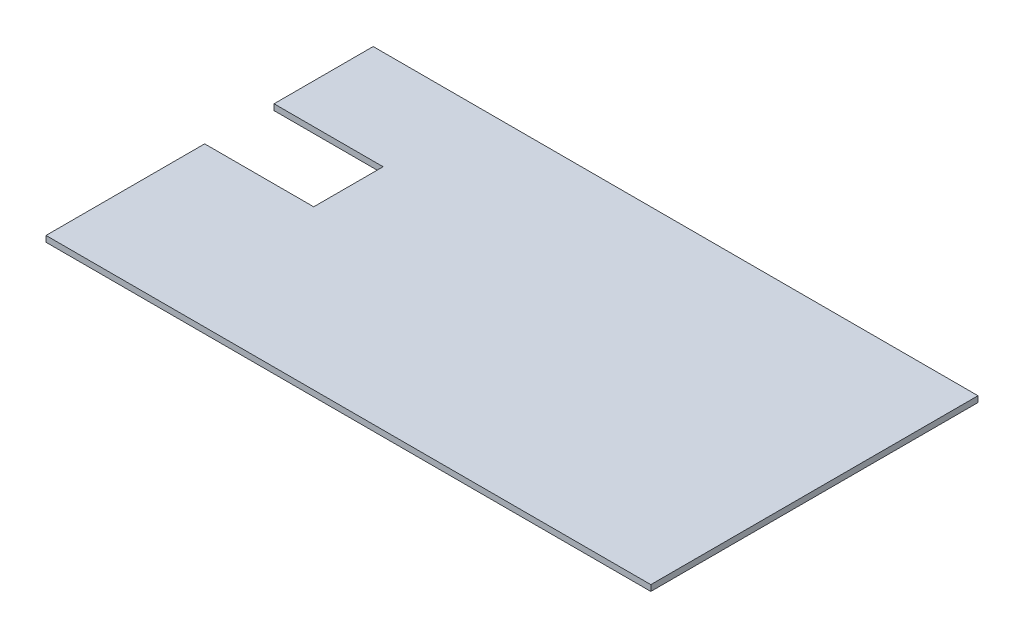
ISO-10303-21;
HEADER;
FILE_DESCRIPTION(('STEP AP214'),'2;1');
FILE_NAME('part.step','',(''),(''),'','','');
FILE_SCHEMA(('AUTOMOTIVE_DESIGN { 1 0 10303 214 1 1 1 1 }'));
ENDSEC;
DATA;
#1=APPLICATION_CONTEXT('core data for automotive mechanical design processes');
#2=APPLICATION_PROTOCOL_DEFINITION('international standard','automotive_design',2000,#1);
#3=PRODUCT_CONTEXT('',#1,'mechanical');
#4=PRODUCT('Part','Part','',(#3));
#5=PRODUCT_RELATED_PRODUCT_CATEGORY('part','',(#4));
#6=PRODUCT_DEFINITION_FORMATION('','',#4);
#7=PRODUCT_DEFINITION_CONTEXT('part definition',#1,'design');
#8=PRODUCT_DEFINITION('design','',#6,#7);
#9=PRODUCT_DEFINITION_SHAPE('','',#8);
#10=(LENGTH_UNIT() NAMED_UNIT(*) SI_UNIT(.MILLI.,.METRE.));
#11=(NAMED_UNIT(*) PLANE_ANGLE_UNIT() SI_UNIT($,.RADIAN.));
#12=(NAMED_UNIT(*) SI_UNIT($,.STERADIAN.) SOLID_ANGLE_UNIT());
#13=UNCERTAINTY_MEASURE_WITH_UNIT(LENGTH_MEASURE(1.E-05),#10,'distance_accuracy_value','');
#14=(GEOMETRIC_REPRESENTATION_CONTEXT(3) GLOBAL_UNCERTAINTY_ASSIGNED_CONTEXT((#13)) GLOBAL_UNIT_ASSIGNED_CONTEXT((#10,
#11,#12)) REPRESENTATION_CONTEXT('',''));
#15=CARTESIAN_POINT('',(0.,0.,0.));
#16=DIRECTION('',(0.,0.,1.));
#17=DIRECTION('',(1.,0.,0.));
#18=AXIS2_PLACEMENT_3D('',#15,#16,#17);
#19=CARTESIAN_POINT('',(-31.,0.,-6.5));
#20=DIRECTION('',(0.,1.,0.));
#21=DIRECTION('',(0.,0.,1.));
#22=AXIS2_PLACEMENT_3D('',#19,#20,#21);
#23=PLANE('',#22);
#24=DIRECTION('',(1.,0.,0.));
#25=VECTOR('',#24,1.);
#26=CARTESIAN_POINT('',(30.,0.,-16.5));
#27=LINE('',#26,#25);
#28=CARTESIAN_POINT('',(-31.,0.,-16.5));
#29=VERTEX_POINT('',#28);
#30=CARTESIAN_POINT('',(30.,0.,-16.5));
#31=VERTEX_POINT('',#30);
#32=EDGE_CURVE('E124',#29,#31,#27,.T.);
#33=ORIENTED_EDGE('',*,*,#32,.T.);
#34=DIRECTION('',(0.,0.,1.));
#35=VECTOR('',#34,1.);
#36=CARTESIAN_POINT('',(30.,0.,16.5));
#37=LINE('',#36,#35);
#38=CARTESIAN_POINT('',(30.,0.,16.5));
#39=VERTEX_POINT('',#38);
#40=EDGE_CURVE('E119',#31,#39,#37,.T.);
#41=ORIENTED_EDGE('',*,*,#40,.T.);
#42=DIRECTION('',(-1.,0.,0.));
#43=VECTOR('',#42,1.);
#44=CARTESIAN_POINT('',(30.,0.,16.5));
#45=LINE('',#44,#43);
#46=CARTESIAN_POINT('',(-31.,0.,16.5));
#47=VERTEX_POINT('',#46);
#48=EDGE_CURVE('E114',#39,#47,#45,.T.);
#49=ORIENTED_EDGE('',*,*,#48,.T.);
#50=DIRECTION('',(0.,0.,-1.));
#51=VECTOR('',#50,1.);
#52=CARTESIAN_POINT('',(-31.,0.,0.5));
#53=LINE('',#52,#51);
#54=CARTESIAN_POINT('',(-31.,0.,0.5));
#55=VERTEX_POINT('',#54);
#56=EDGE_CURVE('E109',#47,#55,#53,.T.);
#57=ORIENTED_EDGE('',*,*,#56,.T.);
#58=DIRECTION('',(1.,0.,0.));
#59=VECTOR('',#58,1.);
#60=CARTESIAN_POINT('',(-20.,0.,0.5));
#61=LINE('',#60,#59);
#62=CARTESIAN_POINT('',(-20.,0.,0.5));
#63=VERTEX_POINT('',#62);
#64=EDGE_CURVE('E105',#55,#63,#61,.T.);
#65=ORIENTED_EDGE('',*,*,#64,.T.);
#66=DIRECTION('',(0.,0.,-1.));
#67=VECTOR('',#66,1.);
#68=CARTESIAN_POINT('',(-20.,0.,-6.5));
#69=LINE('',#68,#67);
#70=CARTESIAN_POINT('',(-20.,0.,-6.5));
#71=VERTEX_POINT('',#70);
#72=EDGE_CURVE('E92',#63,#71,#69,.T.);
#73=ORIENTED_EDGE('',*,*,#72,.T.);
#74=DIRECTION('',(-1.,0.,0.));
#75=VECTOR('',#74,1.);
#76=CARTESIAN_POINT('',(-31.,0.,-6.5));
#77=LINE('',#76,#75);
#78=CARTESIAN_POINT('',(-31.,0.,-6.5));
#79=VERTEX_POINT('',#78);
#80=EDGE_CURVE('E78',#71,#79,#77,.T.);
#81=ORIENTED_EDGE('',*,*,#80,.T.);
#82=DIRECTION('',(0.,0.,-1.));
#83=VECTOR('',#82,1.);
#84=CARTESIAN_POINT('',(-31.,0.,-16.5));
#85=LINE('',#84,#83);
#86=EDGE_CURVE('E19',#79,#29,#85,.T.);
#87=ORIENTED_EDGE('',*,*,#86,.T.);
#88=EDGE_LOOP('',(#33,#41,#49,#57,#65,#73,#81,#87));
#89=FACE_BOUND('',#88,.T.);
#90=ADVANCED_FACE('F16',(#89),#23,.F.);
#91=CARTESIAN_POINT('',(-31.,0.6,-16.5));
#92=DIRECTION('',(1.,0.,0.));
#93=DIRECTION('',(0.,0.,-1.));
#94=AXIS2_PLACEMENT_3D('',#91,#92,#93);
#95=PLANE('',#94);
#96=DIRECTION('',(0.,1.,0.));
#97=VECTOR('',#96,1.);
#98=CARTESIAN_POINT('',(-31.,0.6,-6.5));
#99=LINE('',#98,#97);
#100=CARTESIAN_POINT('',(-31.,0.6,-6.5));
#101=VERTEX_POINT('',#100);
#102=EDGE_CURVE('E84',#79,#101,#99,.T.);
#103=ORIENTED_EDGE('',*,*,#102,.T.);
#104=DIRECTION('',(0.,0.,1.));
#105=VECTOR('',#104,1.);
#106=CARTESIAN_POINT('',(-31.,0.6,-6.5));
#107=LINE('',#106,#105);
#108=CARTESIAN_POINT('',(-31.,0.6,-16.5));
#109=VERTEX_POINT('',#108);
#110=EDGE_CURVE('E126',#109,#101,#107,.T.);
#111=ORIENTED_EDGE('',*,*,#110,.F.);
#112=DIRECTION('',(0.,1.,0.));
#113=VECTOR('',#112,1.);
#114=CARTESIAN_POINT('',(-31.,0.6,-16.5));
#115=LINE('',#114,#113);
#116=EDGE_CURVE('E87',#109,#29,#115,.F.);
#117=ORIENTED_EDGE('',*,*,#116,.T.);
#118=ORIENTED_EDGE('',*,*,#86,.F.);
#119=EDGE_LOOP('',(#103,#111,#117,#118));
#120=FACE_BOUND('',#119,.T.);
#121=ADVANCED_FACE('F83',(#120),#95,.F.);
#122=CARTESIAN_POINT('',(-31.,0.6,-6.5));
#123=DIRECTION('',(0.,0.,-1.));
#124=DIRECTION('',(-1.,0.,0.));
#125=AXIS2_PLACEMENT_3D('',#122,#123,#124);
#126=PLANE('',#125);
#127=DIRECTION('',(0.,1.,0.));
#128=VECTOR('',#127,1.);
#129=CARTESIAN_POINT('',(-20.,0.6,-6.5));
#130=LINE('',#129,#128);
#131=CARTESIAN_POINT('',(-20.,0.6,-6.5));
#132=VERTEX_POINT('',#131);
#133=EDGE_CURVE('E94',#71,#132,#130,.T.);
#134=ORIENTED_EDGE('',*,*,#133,.T.);
#135=DIRECTION('',(1.,0.,0.));
#136=VECTOR('',#135,1.);
#137=CARTESIAN_POINT('',(-31.,0.6,-6.5));
#138=LINE('',#137,#136);
#139=EDGE_CURVE('E98',#101,#132,#138,.T.);
#140=ORIENTED_EDGE('',*,*,#139,.F.);
#141=ORIENTED_EDGE('',*,*,#102,.F.);
#142=ORIENTED_EDGE('',*,*,#80,.F.);
#143=EDGE_LOOP('',(#134,#140,#141,#142));
#144=FACE_BOUND('',#143,.T.);
#145=ADVANCED_FACE('F96',(#144),#126,.F.);
#146=CARTESIAN_POINT('',(-20.,0.6,-6.5));
#147=DIRECTION('',(1.,0.,0.));
#148=DIRECTION('',(0.,0.,-1.));
#149=AXIS2_PLACEMENT_3D('',#146,#147,#148);
#150=PLANE('',#149);
#151=DIRECTION('',(0.,1.,0.));
#152=VECTOR('',#151,1.);
#153=CARTESIAN_POINT('',(-20.,0.6,0.5));
#154=LINE('',#153,#152);
#155=CARTESIAN_POINT('',(-20.,0.6,0.5));
#156=VERTEX_POINT('',#155);
#157=EDGE_CURVE('E103',#63,#156,#154,.T.);
#158=ORIENTED_EDGE('',*,*,#157,.T.);
#159=DIRECTION('',(0.,0.,1.));
#160=VECTOR('',#159,1.);
#161=CARTESIAN_POINT('',(-20.,0.6,-6.5));
#162=LINE('',#161,#160);
#163=EDGE_CURVE('E129',#132,#156,#162,.T.);
#164=ORIENTED_EDGE('',*,*,#163,.F.);
#165=ORIENTED_EDGE('',*,*,#133,.F.);
#166=ORIENTED_EDGE('',*,*,#72,.F.);
#167=EDGE_LOOP('',(#158,#164,#165,#166));
#168=FACE_BOUND('',#167,.T.);
#169=ADVANCED_FACE('F172',(#168),#150,.F.);
#170=CARTESIAN_POINT('',(-20.,0.6,0.5));
#171=DIRECTION('',(0.,0.,1.));
#172=DIRECTION('',(1.,0.,0.));
#173=AXIS2_PLACEMENT_3D('',#170,#171,#172);
#174=PLANE('',#173);
#175=DIRECTION('',(0.,1.,0.));
#176=VECTOR('',#175,1.);
#177=CARTESIAN_POINT('',(-31.,0.6,0.5));
#178=LINE('',#177,#176);
#179=CARTESIAN_POINT('',(-31.,0.6,0.5));
#180=VERTEX_POINT('',#179);
#181=EDGE_CURVE('E107',#55,#180,#178,.T.);
#182=ORIENTED_EDGE('',*,*,#181,.T.);
#183=DIRECTION('',(1.,0.,0.));
#184=VECTOR('',#183,1.);
#185=CARTESIAN_POINT('',(-31.,0.6,0.5));
#186=LINE('',#185,#184);
#187=EDGE_CURVE('E132',#156,#180,#186,.F.);
#188=ORIENTED_EDGE('',*,*,#187,.F.);
#189=ORIENTED_EDGE('',*,*,#157,.F.);
#190=ORIENTED_EDGE('',*,*,#64,.F.);
#191=EDGE_LOOP('',(#182,#188,#189,#190));
#192=FACE_BOUND('',#191,.T.);
#193=ADVANCED_FACE('F168',(#192),#174,.F.);
#194=CARTESIAN_POINT('',(-31.,0.6,0.5));
#195=DIRECTION('',(1.,0.,0.));
#196=DIRECTION('',(0.,0.,-1.));
#197=AXIS2_PLACEMENT_3D('',#194,#195,#196);
#198=PLANE('',#197);
#199=DIRECTION('',(0.,1.,0.));
#200=VECTOR('',#199,1.);
#201=CARTESIAN_POINT('',(-31.,0.6,16.5));
#202=LINE('',#201,#200);
#203=CARTESIAN_POINT('',(-31.,0.6,16.5));
#204=VERTEX_POINT('',#203);
#205=EDGE_CURVE('E112',#47,#204,#202,.T.);
#206=ORIENTED_EDGE('',*,*,#205,.T.);
#207=DIRECTION('',(0.,0.,1.));
#208=VECTOR('',#207,1.);
#209=CARTESIAN_POINT('',(-31.,0.6,-6.5));
#210=LINE('',#209,#208);
#211=EDGE_CURVE('E135',#180,#204,#210,.T.);
#212=ORIENTED_EDGE('',*,*,#211,.F.);
#213=ORIENTED_EDGE('',*,*,#181,.F.);
#214=ORIENTED_EDGE('',*,*,#56,.F.);
#215=EDGE_LOOP('',(#206,#212,#213,#214));
#216=FACE_BOUND('',#215,.T.);
#217=ADVANCED_FACE('F165',(#216),#198,.F.);
#218=CARTESIAN_POINT('',(30.,0.6,16.5));
#219=DIRECTION('',(0.,0.,-1.));
#220=DIRECTION('',(-1.,0.,0.));
#221=AXIS2_PLACEMENT_3D('',#218,#219,#220);
#222=PLANE('',#221);
#223=DIRECTION('',(0.,1.,0.));
#224=VECTOR('',#223,1.);
#225=CARTESIAN_POINT('',(30.,0.6,16.5));
#226=LINE('',#225,#224);
#227=CARTESIAN_POINT('',(30.,0.6,16.5));
#228=VERTEX_POINT('',#227);
#229=EDGE_CURVE('E117',#39,#228,#226,.T.);
#230=ORIENTED_EDGE('',*,*,#229,.T.);
#231=DIRECTION('',(1.,0.,0.));
#232=VECTOR('',#231,1.);
#233=CARTESIAN_POINT('',(-31.,0.6,16.5));
#234=LINE('',#233,#232);
#235=EDGE_CURVE('E138',#204,#228,#234,.T.);
#236=ORIENTED_EDGE('',*,*,#235,.F.);
#237=ORIENTED_EDGE('',*,*,#205,.F.);
#238=ORIENTED_EDGE('',*,*,#48,.F.);
#239=EDGE_LOOP('',(#230,#236,#237,#238));
#240=FACE_BOUND('',#239,.T.);
#241=ADVANCED_FACE('F148',(#240),#222,.F.);
#242=CARTESIAN_POINT('',(30.,0.6,16.5));
#243=DIRECTION('',(-1.,0.,0.));
#244=DIRECTION('',(0.,0.,1.));
#245=AXIS2_PLACEMENT_3D('',#242,#243,#244);
#246=PLANE('',#245);
#247=DIRECTION('',(0.,1.,0.));
#248=VECTOR('',#247,1.);
#249=CARTESIAN_POINT('',(30.,0.6,-16.5));
#250=LINE('',#249,#248);
#251=CARTESIAN_POINT('',(30.,0.6,-16.5));
#252=VERTEX_POINT('',#251);
#253=EDGE_CURVE('E34',#31,#252,#250,.T.);
#254=ORIENTED_EDGE('',*,*,#253,.T.);
#255=DIRECTION('',(0.,0.,1.));
#256=VECTOR('',#255,1.);
#257=CARTESIAN_POINT('',(30.,0.6,-6.5));
#258=LINE('',#257,#256);
#259=EDGE_CURVE('E25',#228,#252,#258,.F.);
#260=ORIENTED_EDGE('',*,*,#259,.F.);
#261=ORIENTED_EDGE('',*,*,#229,.F.);
#262=ORIENTED_EDGE('',*,*,#40,.F.);
#263=EDGE_LOOP('',(#254,#260,#261,#262));
#264=FACE_BOUND('',#263,.T.);
#265=ADVANCED_FACE('F146',(#264),#246,.F.);
#266=CARTESIAN_POINT('',(30.,0.6,-16.5));
#267=DIRECTION('',(0.,0.,1.));
#268=DIRECTION('',(1.,0.,0.));
#269=AXIS2_PLACEMENT_3D('',#266,#267,#268);
#270=PLANE('',#269);
#271=ORIENTED_EDGE('',*,*,#116,.F.);
#272=DIRECTION('',(1.,0.,0.));
#273=VECTOR('',#272,1.);
#274=CARTESIAN_POINT('',(-31.,0.6,-16.5));
#275=LINE('',#274,#273);
#276=EDGE_CURVE('E11',#252,#109,#275,.F.);
#277=ORIENTED_EDGE('',*,*,#276,.F.);
#278=ORIENTED_EDGE('',*,*,#253,.F.);
#279=ORIENTED_EDGE('',*,*,#32,.F.);
#280=EDGE_LOOP('',(#271,#277,#278,#279));
#281=FACE_BOUND('',#280,.T.);
#282=ADVANCED_FACE('F151',(#281),#270,.F.);
#283=CARTESIAN_POINT('',(-31.,0.6,-6.5));
#284=DIRECTION('',(0.,1.,0.));
#285=DIRECTION('',(0.,0.,1.));
#286=AXIS2_PLACEMENT_3D('',#283,#284,#285);
#287=PLANE('',#286);
#288=ORIENTED_EDGE('',*,*,#259,.T.);
#289=ORIENTED_EDGE('',*,*,#276,.T.);
#290=ORIENTED_EDGE('',*,*,#110,.T.);
#291=ORIENTED_EDGE('',*,*,#139,.T.);
#292=ORIENTED_EDGE('',*,*,#163,.T.);
#293=ORIENTED_EDGE('',*,*,#187,.T.);
#294=ORIENTED_EDGE('',*,*,#211,.T.);
#295=ORIENTED_EDGE('',*,*,#235,.T.);
#296=EDGE_LOOP('',(#288,#289,#290,#291,#292,#293,#294,#295));
#297=FACE_BOUND('',#296,.T.);
#298=ADVANCED_FACE('F143',(#297),#287,.T.);
#299=CLOSED_SHELL('',(#90,#121,#145,#169,#193,#217,#241,#265,#282,#298));
#300=MANIFOLD_SOLID_BREP('B1',#299);
#301=ADVANCED_BREP_SHAPE_REPRESENTATION('',(#18,#300),#14);
#302=SHAPE_DEFINITION_REPRESENTATION(#9,#301);
ENDSEC;
END-ISO-10303-21;
